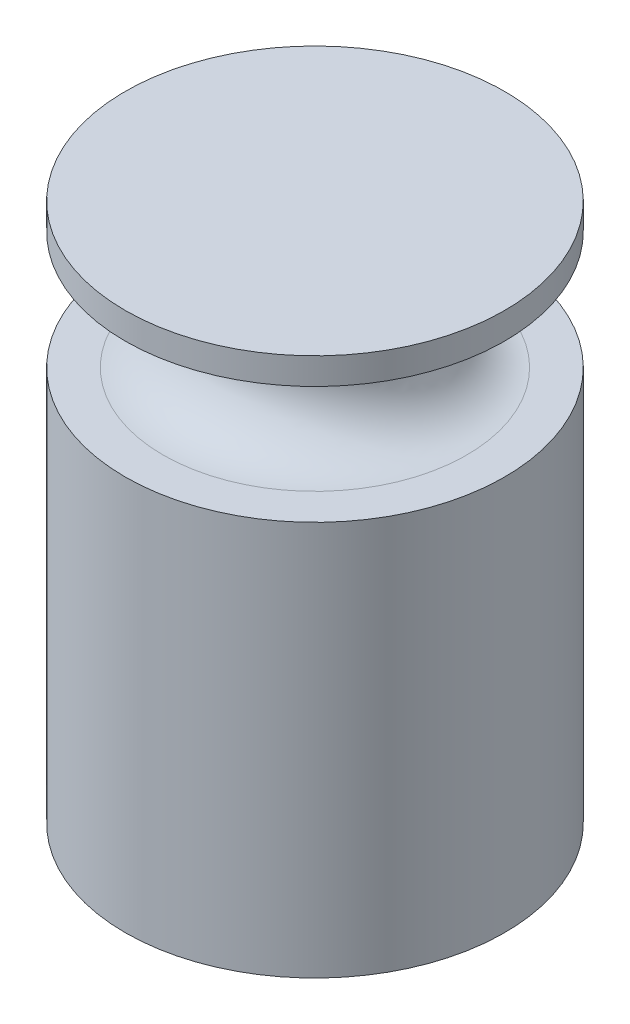
ISO-10303-21;
HEADER;
FILE_DESCRIPTION(('STEP AP214'),'2;1');
FILE_NAME('part.step','',(''),(''),'','','');
FILE_SCHEMA(('AUTOMOTIVE_DESIGN { 1 0 10303 214 1 1 1 1 }'));
ENDSEC;
DATA;
#1=APPLICATION_CONTEXT('core data for automotive mechanical design processes');
#2=APPLICATION_PROTOCOL_DEFINITION('international standard','automotive_design',2000,#1);
#3=PRODUCT_CONTEXT('',#1,'mechanical');
#4=PRODUCT('Part','Part','',(#3));
#5=PRODUCT_RELATED_PRODUCT_CATEGORY('part','',(#4));
#6=PRODUCT_DEFINITION_FORMATION('','',#4);
#7=PRODUCT_DEFINITION_CONTEXT('part definition',#1,'design');
#8=PRODUCT_DEFINITION('design','',#6,#7);
#9=PRODUCT_DEFINITION_SHAPE('','',#8);
#10=(LENGTH_UNIT() NAMED_UNIT(*) SI_UNIT(.MILLI.,.METRE.));
#11=(NAMED_UNIT(*) PLANE_ANGLE_UNIT() SI_UNIT($,.RADIAN.));
#12=(NAMED_UNIT(*) SI_UNIT($,.STERADIAN.) SOLID_ANGLE_UNIT());
#13=UNCERTAINTY_MEASURE_WITH_UNIT(LENGTH_MEASURE(1.E-05),#10,'distance_accuracy_value','');
#14=(GEOMETRIC_REPRESENTATION_CONTEXT(3) GLOBAL_UNCERTAINTY_ASSIGNED_CONTEXT((#13)) GLOBAL_UNIT_ASSIGNED_CONTEXT((#10,
#11,#12)) REPRESENTATION_CONTEXT('',''));
#15=CARTESIAN_POINT('',(0.,0.,0.));
#16=DIRECTION('',(0.,0.,1.));
#17=DIRECTION('',(1.,0.,0.));
#18=AXIS2_PLACEMENT_3D('',#15,#16,#17);
#19=CARTESIAN_POINT('',(0.,0.,0.));
#20=DIRECTION('',(0.,1.,0.));
#21=DIRECTION('',(0.,0.,1.));
#22=AXIS2_PLACEMENT_3D('',#19,#20,#21);
#23=PLANE('',#22);
#24=CARTESIAN_POINT('',(0.,0.,0.));
#25=DIRECTION('',(0.,1.,0.));
#26=DIRECTION('',(0.,0.,1.));
#27=AXIS2_PLACEMENT_3D('',#24,#25,#26);
#28=CIRCLE('',#27,25.);
#29=CARTESIAN_POINT('',(0.,0.,25.));
#30=VERTEX_POINT('',#29);
#31=EDGE_CURVE('E10',#30,#30,#28,.T.);
#32=ORIENTED_EDGE('',*,*,#31,.F.);
#33=EDGE_LOOP('',(#32));
#34=FACE_BOUND('',#33,.T.);
#35=ADVANCED_FACE('F31',(#34),#23,.F.);
#36=CARTESIAN_POINT('',(0.,52.6038322345156,0.));
#37=DIRECTION('',(0.,1.,0.));
#38=DIRECTION('',(0.,0.,1.));
#39=AXIS2_PLACEMENT_3D('',#36,#37,#38);
#40=CYLINDRICAL_SURFACE('',#39,25.);
#41=CARTESIAN_POINT('',(0.,52.,0.));
#42=DIRECTION('',(0.,1.,0.));
#43=DIRECTION('',(0.,0.,1.));
#44=AXIS2_PLACEMENT_3D('',#41,#42,#43);
#45=CIRCLE('',#44,25.);
#46=CARTESIAN_POINT('',(0.,52.,25.));
#47=VERTEX_POINT('',#46);
#48=EDGE_CURVE('E37',#47,#47,#45,.T.);
#49=ORIENTED_EDGE('',*,*,#48,.F.);
#50=EDGE_LOOP('',(#49));
#51=FACE_BOUND('',#50,.T.);
#52=ORIENTED_EDGE('',*,*,#31,.T.);
#53=EDGE_LOOP('',(#52));
#54=FACE_BOUND('',#53,.T.);
#55=ADVANCED_FACE('F79',(#51,#54),#40,.T.);
#56=CARTESIAN_POINT('',(25.,52.,0.));
#57=DIRECTION('',(0.,-1.,0.));
#58=DIRECTION('',(0.,0.,-1.));
#59=AXIS2_PLACEMENT_3D('',#56,#57,#58);
#60=PLANE('',#59);
#61=CARTESIAN_POINT('',(0.,52.,0.));
#62=DIRECTION('',(0.,1.,0.));
#63=DIRECTION('',(0.,0.,1.));
#64=AXIS2_PLACEMENT_3D('',#61,#62,#63);
#65=CIRCLE('',#64,20.);
#66=CARTESIAN_POINT('',(0.,52.,20.));
#67=VERTEX_POINT('',#66);
#68=EDGE_CURVE('E41',#67,#67,#65,.T.);
#69=ORIENTED_EDGE('',*,*,#68,.F.);
#70=EDGE_LOOP('',(#69));
#71=FACE_BOUND('',#70,.T.);
#72=ORIENTED_EDGE('',*,*,#48,.T.);
#73=EDGE_LOOP('',(#72));
#74=FACE_BOUND('',#73,.T.);
#75=ADVANCED_FACE('F74',(#71,#74),#60,.F.);
#76=CARTESIAN_POINT('',(0.,59.75,0.));
#77=DIRECTION('',(0.,1.,0.));
#78=DIRECTION('',(0.,0.,1.));
#79=AXIS2_PLACEMENT_3D('',#76,#77,#78);
#80=TOROIDAL_SURFACE('',#79,20.,7.75);
#81=CARTESIAN_POINT('',(0.,67.5,0.));
#82=DIRECTION('',(0.,1.,0.));
#83=DIRECTION('',(0.,0.,1.));
#84=AXIS2_PLACEMENT_3D('',#81,#82,#83);
#85=CIRCLE('',#84,20.);
#86=CARTESIAN_POINT('',(0.,67.5,20.));
#87=VERTEX_POINT('',#86);
#88=EDGE_CURVE('E45',#87,#87,#85,.T.);
#89=ORIENTED_EDGE('',*,*,#88,.F.);
#90=EDGE_LOOP('',(#89));
#91=FACE_BOUND('',#90,.T.);
#92=ORIENTED_EDGE('',*,*,#68,.T.);
#93=EDGE_LOOP('',(#92));
#94=FACE_BOUND('',#93,.T.);
#95=ADVANCED_FACE('F68',(#91,#94),#80,.F.);
#96=CARTESIAN_POINT('',(20.,67.5,0.));
#97=DIRECTION('',(0.,1.,0.));
#98=DIRECTION('',(0.,0.,1.));
#99=AXIS2_PLACEMENT_3D('',#96,#97,#98);
#100=PLANE('',#99);
#101=CARTESIAN_POINT('',(0.,67.5,0.));
#102=DIRECTION('',(0.,1.,0.));
#103=DIRECTION('',(0.,0.,1.));
#104=AXIS2_PLACEMENT_3D('',#101,#102,#103);
#105=CIRCLE('',#104,25.);
#106=CARTESIAN_POINT('',(0.,67.5,25.));
#107=VERTEX_POINT('',#106);
#108=EDGE_CURVE('E50',#107,#107,#105,.T.);
#109=ORIENTED_EDGE('',*,*,#108,.F.);
#110=EDGE_LOOP('',(#109));
#111=FACE_BOUND('',#110,.T.);
#112=ORIENTED_EDGE('',*,*,#88,.T.);
#113=EDGE_LOOP('',(#112));
#114=FACE_BOUND('',#113,.T.);
#115=ADVANCED_FACE('F62',(#111,#114),#100,.F.);
#116=CARTESIAN_POINT('',(0.,52.6038322345156,0.));
#117=DIRECTION('',(0.,1.,0.));
#118=DIRECTION('',(0.,0.,1.));
#119=AXIS2_PLACEMENT_3D('',#116,#117,#118);
#120=CYLINDRICAL_SURFACE('',#119,25.);
#121=CARTESIAN_POINT('',(0.,71.,0.));
#122=DIRECTION('',(0.,1.,0.));
#123=DIRECTION('',(0.,0.,1.));
#124=AXIS2_PLACEMENT_3D('',#121,#122,#123);
#125=CIRCLE('',#124,25.);
#126=CARTESIAN_POINT('',(0.,71.,25.));
#127=VERTEX_POINT('',#126);
#128=EDGE_CURVE('E53',#127,#127,#125,.T.);
#129=ORIENTED_EDGE('',*,*,#128,.F.);
#130=EDGE_LOOP('',(#129));
#131=FACE_BOUND('',#130,.T.);
#132=ORIENTED_EDGE('',*,*,#108,.T.);
#133=EDGE_LOOP('',(#132));
#134=FACE_BOUND('',#133,.T.);
#135=ADVANCED_FACE('F59',(#131,#134),#120,.T.);
#136=CARTESIAN_POINT('',(25.,71.,0.));
#137=DIRECTION('',(0.,-1.,0.));
#138=DIRECTION('',(0.,0.,-1.));
#139=AXIS2_PLACEMENT_3D('',#136,#137,#138);
#140=PLANE('',#139);
#141=ORIENTED_EDGE('',*,*,#128,.T.);
#142=EDGE_LOOP('',(#141));
#143=FACE_BOUND('',#142,.T.);
#144=ADVANCED_FACE('F57',(#143),#140,.F.);
#145=CLOSED_SHELL('',(#35,#55,#75,#95,#115,#135,#144));
#146=MANIFOLD_SOLID_BREP('B2',#145);
#147=ADVANCED_BREP_SHAPE_REPRESENTATION('',(#18,#146),#14);
#148=SHAPE_DEFINITION_REPRESENTATION(#9,#147);
ENDSEC;
END-ISO-10303-21;
